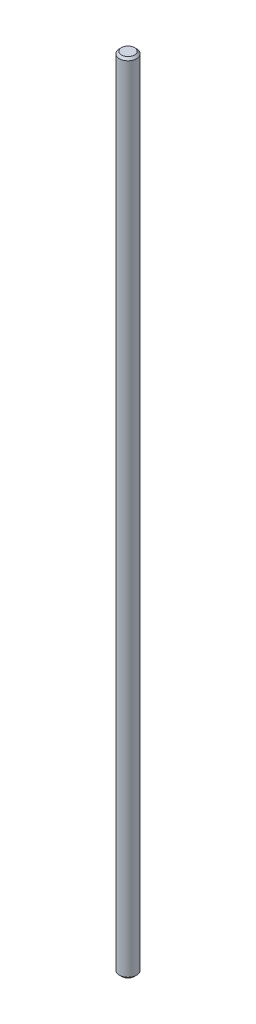
ISO-10303-21;
HEADER;
FILE_DESCRIPTION(('STEP AP214'),'2;1');
FILE_NAME('part.step','',(''),(''),'','','');
FILE_SCHEMA(('AUTOMOTIVE_DESIGN { 1 0 10303 214 1 1 1 1 }'));
ENDSEC;
DATA;
#1=APPLICATION_CONTEXT('core data for automotive mechanical design processes');
#2=APPLICATION_PROTOCOL_DEFINITION('international standard','automotive_design',2000,#1);
#3=PRODUCT_CONTEXT('',#1,'mechanical');
#4=PRODUCT('Part','Part','',(#3));
#5=PRODUCT_RELATED_PRODUCT_CATEGORY('part','',(#4));
#6=PRODUCT_DEFINITION_FORMATION('','',#4);
#7=PRODUCT_DEFINITION_CONTEXT('part definition',#1,'design');
#8=PRODUCT_DEFINITION('design','',#6,#7);
#9=PRODUCT_DEFINITION_SHAPE('','',#8);
#10=(LENGTH_UNIT() NAMED_UNIT(*) SI_UNIT(.MILLI.,.METRE.));
#11=(NAMED_UNIT(*) PLANE_ANGLE_UNIT() SI_UNIT($,.RADIAN.));
#12=(NAMED_UNIT(*) SI_UNIT($,.STERADIAN.) SOLID_ANGLE_UNIT());
#13=UNCERTAINTY_MEASURE_WITH_UNIT(LENGTH_MEASURE(1.E-05),#10,'distance_accuracy_value','');
#14=(GEOMETRIC_REPRESENTATION_CONTEXT(3) GLOBAL_UNCERTAINTY_ASSIGNED_CONTEXT((#13)) GLOBAL_UNIT_ASSIGNED_CONTEXT((#10,
#11,#12)) REPRESENTATION_CONTEXT('',''));
#15=CARTESIAN_POINT('',(0.,0.,0.));
#16=DIRECTION('',(0.,0.,1.));
#17=DIRECTION('',(1.,0.,0.));
#18=AXIS2_PLACEMENT_3D('',#15,#16,#17);
#19=CARTESIAN_POINT('',(0.,370.,0.));
#20=DIRECTION('',(0.,-1.,0.));
#21=DIRECTION('',(0.,0.,-1.));
#22=AXIS2_PLACEMENT_3D('',#19,#20,#21);
#23=CYLINDRICAL_SURFACE('',#22,4.);
#24=CARTESIAN_POINT('',(0.,1.00000000000006,0.));
#25=DIRECTION('',(0.,1.,0.));
#26=DIRECTION('',(0.,0.,1.));
#27=AXIS2_PLACEMENT_3D('',#24,#25,#26);
#28=CIRCLE('',#27,4.);
#29=CARTESIAN_POINT('',(0.,1.00000000000006,4.));
#30=VERTEX_POINT('',#29);
#31=EDGE_CURVE('E41',#30,#30,#28,.T.);
#32=ORIENTED_EDGE('',*,*,#31,.T.);
#33=EDGE_LOOP('',(#32));
#34=FACE_BOUND('',#33,.T.);
#35=CARTESIAN_POINT('',(0.,369.,0.));
#36=DIRECTION('',(0.,1.,0.));
#37=DIRECTION('',(0.,0.,1.));
#38=AXIS2_PLACEMENT_3D('',#35,#36,#37);
#39=CIRCLE('',#38,4.);
#40=CARTESIAN_POINT('',(0.,369.,4.));
#41=VERTEX_POINT('',#40);
#42=EDGE_CURVE('E45',#41,#41,#39,.F.);
#43=ORIENTED_EDGE('',*,*,#42,.T.);
#44=EDGE_LOOP('',(#43));
#45=FACE_BOUND('',#44,.T.);
#46=ADVANCED_FACE('F30',(#34,#45),#23,.T.);
#47=CARTESIAN_POINT('',(0.,370.,0.));
#48=DIRECTION('',(0.,1.,0.));
#49=DIRECTION('',(0.,0.,1.));
#50=AXIS2_PLACEMENT_3D('',#47,#48,#49);
#51=PLANE('',#50);
#52=CARTESIAN_POINT('',(0.,370.,0.));
#53=DIRECTION('',(0.,1.,0.));
#54=DIRECTION('',(0.,0.,1.));
#55=AXIS2_PLACEMENT_3D('',#52,#53,#54);
#56=CIRCLE('',#55,3.00000000000006);
#57=CARTESIAN_POINT('',(0.,370.,3.00000000000006));
#58=VERTEX_POINT('',#57);
#59=EDGE_CURVE('E10',#58,#58,#56,.T.);
#60=ORIENTED_EDGE('',*,*,#59,.T.);
#61=EDGE_LOOP('',(#60));
#62=FACE_BOUND('',#61,.T.);
#63=ADVANCED_FACE('F61',(#62),#51,.T.);
#64=CARTESIAN_POINT('',(0.,0.,0.));
#65=DIRECTION('',(0.,1.,0.));
#66=DIRECTION('',(0.,0.,1.));
#67=AXIS2_PLACEMENT_3D('',#64,#65,#66);
#68=PLANE('',#67);
#69=CARTESIAN_POINT('',(0.,0.,0.));
#70=DIRECTION('',(0.,1.,0.));
#71=DIRECTION('',(0.,0.,1.));
#72=AXIS2_PLACEMENT_3D('',#69,#70,#71);
#73=CIRCLE('',#72,2.99999999999989);
#74=CARTESIAN_POINT('',(0.,0.,2.99999999999989));
#75=VERTEX_POINT('',#74);
#76=EDGE_CURVE('E37',#75,#75,#73,.F.);
#77=ORIENTED_EDGE('',*,*,#76,.T.);
#78=EDGE_LOOP('',(#77));
#79=FACE_BOUND('',#78,.T.);
#80=ADVANCED_FACE('F58',(#79),#68,.F.);
#81=CARTESIAN_POINT('',(0.,1.00000000000006,0.));
#82=DIRECTION('',(0.,1.,0.));
#83=DIRECTION('',(0.,0.,1.));
#84=AXIS2_PLACEMENT_3D('',#81,#82,#83);
#85=CONICAL_SURFACE('',#84,4.,0.785398163397474);
#86=ORIENTED_EDGE('',*,*,#76,.F.);
#87=EDGE_LOOP('',(#86));
#88=FACE_BOUND('',#87,.T.);
#89=ORIENTED_EDGE('',*,*,#31,.F.);
#90=EDGE_LOOP('',(#89));
#91=FACE_BOUND('',#90,.T.);
#92=ADVANCED_FACE('F54',(#88,#91),#85,.T.);
#93=CARTESIAN_POINT('',(0.,370.,0.));
#94=DIRECTION('',(0.,-1.,0.));
#95=DIRECTION('',(0.,0.,-1.));
#96=AXIS2_PLACEMENT_3D('',#93,#94,#95);
#97=CONICAL_SURFACE('',#96,3.00000000000006,0.785398163397447);
#98=ORIENTED_EDGE('',*,*,#42,.F.);
#99=EDGE_LOOP('',(#98));
#100=FACE_BOUND('',#99,.T.);
#101=ORIENTED_EDGE('',*,*,#59,.F.);
#102=EDGE_LOOP('',(#101));
#103=FACE_BOUND('',#102,.T.);
#104=ADVANCED_FACE('F32',(#100,#103),#97,.T.);
#105=CLOSED_SHELL('',(#46,#63,#80,#92,#104));
#106=MANIFOLD_SOLID_BREP('B2',#105);
#107=ADVANCED_BREP_SHAPE_REPRESENTATION('',(#18,#106),#14);
#108=SHAPE_DEFINITION_REPRESENTATION(#9,#107);
ENDSEC;
END-ISO-10303-21;
